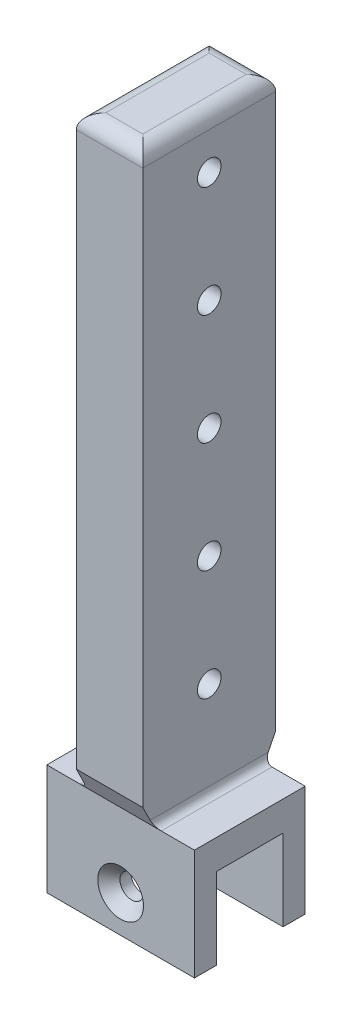
ISO-10303-21;
HEADER;
FILE_DESCRIPTION(('STEP AP214'),'2;1');
FILE_NAME('part.step','',(''),(''),'','','');
FILE_SCHEMA(('AUTOMOTIVE_DESIGN { 1 0 10303 214 1 1 1 1 }'));
ENDSEC;
DATA;
#1=APPLICATION_CONTEXT('core data for automotive mechanical design processes');
#2=APPLICATION_PROTOCOL_DEFINITION('international standard','automotive_design',2000,#1);
#3=PRODUCT_CONTEXT('',#1,'mechanical');
#4=PRODUCT('Part','Part','',(#3));
#5=PRODUCT_RELATED_PRODUCT_CATEGORY('part','',(#4));
#6=PRODUCT_DEFINITION_FORMATION('','',#4);
#7=PRODUCT_DEFINITION_CONTEXT('part definition',#1,'design');
#8=PRODUCT_DEFINITION('design','',#6,#7);
#9=PRODUCT_DEFINITION_SHAPE('','',#8);
#10=(LENGTH_UNIT() NAMED_UNIT(*) SI_UNIT(.MILLI.,.METRE.));
#11=(NAMED_UNIT(*) PLANE_ANGLE_UNIT() SI_UNIT($,.RADIAN.));
#12=(NAMED_UNIT(*) SI_UNIT($,.STERADIAN.) SOLID_ANGLE_UNIT());
#13=UNCERTAINTY_MEASURE_WITH_UNIT(LENGTH_MEASURE(1.E-05),#10,'distance_accuracy_value','');
#14=(GEOMETRIC_REPRESENTATION_CONTEXT(3) GLOBAL_UNCERTAINTY_ASSIGNED_CONTEXT((#13)) GLOBAL_UNIT_ASSIGNED_CONTEXT((#10,
#11,#12)) REPRESENTATION_CONTEXT('',''));
#15=CARTESIAN_POINT('',(0.,0.,0.));
#16=DIRECTION('',(0.,0.,1.));
#17=DIRECTION('',(1.,0.,0.));
#18=AXIS2_PLACEMENT_3D('',#15,#16,#17);
#19=CARTESIAN_POINT('',(0.,-15.,0.));
#20=DIRECTION('',(0.,-1.,0.));
#21=DIRECTION('',(0.,0.,-1.));
#22=AXIS2_PLACEMENT_3D('',#19,#20,#21);
#23=PLANE('',#22);
#24=DIRECTION('',(1.,0.,0.));
#25=VECTOR('',#24,1.);
#26=CARTESIAN_POINT('',(-14.5,-15.,-4.50000000000001));
#27=LINE('',#26,#25);
#28=CARTESIAN_POINT('',(-14.5,-15.,-4.50000000000001));
#29=VERTEX_POINT('',#28);
#30=CARTESIAN_POINT('',(5.5,-15.,-4.50000000000001));
#31=VERTEX_POINT('',#30);
#32=EDGE_CURVE('E392',#29,#31,#27,.T.);
#33=ORIENTED_EDGE('',*,*,#32,.T.);
#34=DIRECTION('',(0.,0.,1.));
#35=VECTOR('',#34,1.);
#36=CARTESIAN_POINT('',(5.5,-15.,-1.5));
#37=LINE('',#36,#35);
#38=CARTESIAN_POINT('',(5.5,-15.,-1.5));
#39=VERTEX_POINT('',#38);
#40=EDGE_CURVE('E381',#31,#39,#37,.T.);
#41=ORIENTED_EDGE('',*,*,#40,.T.);
#42=DIRECTION('',(-1.,0.,0.));
#43=VECTOR('',#42,1.);
#44=CARTESIAN_POINT('',(-14.5,-15.,-1.5));
#45=LINE('',#44,#43);
#46=CARTESIAN_POINT('',(-14.5,-15.,-1.5));
#47=VERTEX_POINT('',#46);
#48=EDGE_CURVE('E384',#39,#47,#45,.T.);
#49=ORIENTED_EDGE('',*,*,#48,.T.);
#50=DIRECTION('',(0.,0.,-1.));
#51=VECTOR('',#50,1.);
#52=CARTESIAN_POINT('',(-14.5,-15.,-1.5));
#53=LINE('',#52,#51);
#54=EDGE_CURVE('E367',#47,#29,#53,.T.);
#55=ORIENTED_EDGE('',*,*,#54,.T.);
#56=EDGE_LOOP('',(#33,#41,#49,#55));
#57=FACE_BOUND('',#56,.T.);
#58=ADVANCED_FACE('F43',(#57),#23,.T.);
#59=CARTESIAN_POINT('',(0.,80.,0.));
#60=DIRECTION('',(-1.,0.,0.));
#61=DIRECTION('',(0.,0.,1.));
#62=AXIS2_PLACEMENT_3D('',#59,#60,#61);
#63=PLANE('',#62);
#64=CARTESIAN_POINT('',(0.,73.,-9.));
#65=DIRECTION('',(1.,0.,0.));
#66=DIRECTION('',(0.,0.,-1.));
#67=AXIS2_PLACEMENT_3D('',#64,#65,#66);
#68=CIRCLE('',#67,1.6);
#69=CARTESIAN_POINT('',(0.,73.,-10.6));
#70=VERTEX_POINT('',#69);
#71=EDGE_CURVE('E260',#70,#70,#68,.T.);
#72=ORIENTED_EDGE('',*,*,#71,.F.);
#73=EDGE_LOOP('',(#72));
#74=FACE_BOUND('',#73,.T.);
#75=CARTESIAN_POINT('',(0.,58.,-9.00000000000001));
#76=DIRECTION('',(1.,0.,0.));
#77=DIRECTION('',(0.,0.,-1.));
#78=AXIS2_PLACEMENT_3D('',#75,#76,#77);
#79=CIRCLE('',#78,1.6);
#80=CARTESIAN_POINT('',(0.,58.,-10.6));
#81=VERTEX_POINT('',#80);
#82=EDGE_CURVE('E458',#81,#81,#79,.T.);
#83=ORIENTED_EDGE('',*,*,#82,.F.);
#84=EDGE_LOOP('',(#83));
#85=FACE_BOUND('',#84,.T.);
#86=CARTESIAN_POINT('',(0.,43.,-9.));
#87=DIRECTION('',(1.,0.,0.));
#88=DIRECTION('',(0.,0.,-1.));
#89=AXIS2_PLACEMENT_3D('',#86,#87,#88);
#90=CIRCLE('',#89,1.6);
#91=CARTESIAN_POINT('',(0.,43.,-10.6));
#92=VERTEX_POINT('',#91);
#93=EDGE_CURVE('E462',#92,#92,#90,.T.);
#94=ORIENTED_EDGE('',*,*,#93,.F.);
#95=EDGE_LOOP('',(#94));
#96=FACE_BOUND('',#95,.T.);
#97=CARTESIAN_POINT('',(0.,28.,-9.));
#98=DIRECTION('',(1.,0.,0.));
#99=DIRECTION('',(0.,0.,-1.));
#100=AXIS2_PLACEMENT_3D('',#97,#98,#99);
#101=CIRCLE('',#100,1.6);
#102=CARTESIAN_POINT('',(0.,28.,-10.6));
#103=VERTEX_POINT('',#102);
#104=EDGE_CURVE('E450',#103,#103,#101,.T.);
#105=ORIENTED_EDGE('',*,*,#104,.F.);
#106=EDGE_LOOP('',(#105));
#107=FACE_BOUND('',#106,.T.);
#108=CARTESIAN_POINT('',(0.,13.,-9.));
#109=DIRECTION('',(1.,0.,0.));
#110=DIRECTION('',(0.,0.,-1.));
#111=AXIS2_PLACEMENT_3D('',#108,#109,#110);
#112=CIRCLE('',#111,1.6);
#113=CARTESIAN_POINT('',(0.,13.,-10.6));
#114=VERTEX_POINT('',#113);
#115=EDGE_CURVE('E444',#114,#114,#112,.T.);
#116=ORIENTED_EDGE('',*,*,#115,.F.);
#117=EDGE_LOOP('',(#116));
#118=FACE_BOUND('',#117,.T.);
#119=DIRECTION('',(0.,-0.894427190999916,-0.447213595499958));
#120=VECTOR('',#119,1.);
#121=CARTESIAN_POINT('',(0.,64.6,30.8));
#122=LINE('',#121,#120);
#123=CARTESIAN_POINT('',(0.,3.,0.));
#124=VERTEX_POINT('',#123);
#125=CARTESIAN_POINT('',(0.,1.,-0.999999999999994));
#126=VERTEX_POINT('',#125);
#127=EDGE_CURVE('E189',#124,#126,#122,.T.);
#128=ORIENTED_EDGE('',*,*,#127,.T.);
#129=DIRECTION('',(0.,0.,-1.));
#130=VECTOR('',#129,1.);
#131=CARTESIAN_POINT('',(0.,1.,-16.5));
#132=LINE('',#131,#130);
#133=CARTESIAN_POINT('',(0.,0.999999999999987,-17.));
#134=VERTEX_POINT('',#133);
#135=EDGE_CURVE('E239',#126,#134,#132,.T.);
#136=ORIENTED_EDGE('',*,*,#135,.T.);
#137=DIRECTION('',(0.,0.894427190999916,-0.447213595499958));
#138=VECTOR('',#137,1.);
#139=CARTESIAN_POINT('',(0.,57.4,-45.2));
#140=LINE('',#139,#138);
#141=CARTESIAN_POINT('',(0.,3.,-18.));
#142=VERTEX_POINT('',#141);
#143=EDGE_CURVE('E442',#134,#142,#140,.T.);
#144=ORIENTED_EDGE('',*,*,#143,.T.);
#145=DIRECTION('',(0.,-1.,0.));
#146=VECTOR('',#145,1.);
#147=CARTESIAN_POINT('',(0.,80.,-18.));
#148=LINE('',#147,#146);
#149=CARTESIAN_POINT('',(0.,78.,-18.));
#150=VERTEX_POINT('',#149);
#151=EDGE_CURVE('E187',#150,#142,#148,.T.);
#152=ORIENTED_EDGE('',*,*,#151,.F.);
#153=DIRECTION('',(0.,0.,-1.));
#154=VECTOR('',#153,1.);
#155=CARTESIAN_POINT('',(0.,78.,0.));
#156=LINE('',#155,#154);
#157=CARTESIAN_POINT('',(0.,78.,0.));
#158=VERTEX_POINT('',#157);
#159=EDGE_CURVE('E231',#150,#158,#156,.F.);
#160=ORIENTED_EDGE('',*,*,#159,.T.);
#161=DIRECTION('',(0.,-1.,0.));
#162=VECTOR('',#161,1.);
#163=CARTESIAN_POINT('',(0.,80.,0.));
#164=LINE('',#163,#162);
#165=EDGE_CURVE('E204',#158,#124,#164,.T.);
#166=ORIENTED_EDGE('',*,*,#165,.T.);
#167=EDGE_LOOP('',(#128,#136,#144,#152,#160,#166));
#168=FACE_BOUND('',#167,.T.);
#169=ADVANCED_FACE('F318',(#74,#85,#96,#107,#118,#168),#63,.F.);
#170=CARTESIAN_POINT('',(0.,80.,-18.));
#171=DIRECTION('',(0.,0.,1.));
#172=DIRECTION('',(1.,0.,0.));
#173=AXIS2_PLACEMENT_3D('',#170,#171,#172);
#174=PLANE('',#173);
#175=ORIENTED_EDGE('',*,*,#151,.T.);
#176=DIRECTION('',(-1.,0.,0.));
#177=VECTOR('',#176,1.);
#178=CARTESIAN_POINT('',(1.,3.,-18.));
#179=LINE('',#178,#177);
#180=CARTESIAN_POINT('',(-9.,3.,-18.));
#181=VERTEX_POINT('',#180);
#182=EDGE_CURVE('E170',#142,#181,#179,.T.);
#183=ORIENTED_EDGE('',*,*,#182,.T.);
#184=DIRECTION('',(0.,-1.,0.));
#185=VECTOR('',#184,1.);
#186=CARTESIAN_POINT('',(-9.,80.,-18.));
#187=LINE('',#186,#185);
#188=CARTESIAN_POINT('',(-9.,78.,-18.));
#189=VERTEX_POINT('',#188);
#190=EDGE_CURVE('E184',#189,#181,#187,.T.);
#191=ORIENTED_EDGE('',*,*,#190,.F.);
#192=DIRECTION('',(-1.,0.,0.));
#193=VECTOR('',#192,1.);
#194=CARTESIAN_POINT('',(0.,78.,-18.));
#195=LINE('',#194,#193);
#196=EDGE_CURVE('E236',#189,#150,#195,.F.);
#197=ORIENTED_EDGE('',*,*,#196,.T.);
#198=EDGE_LOOP('',(#175,#183,#191,#197));
#199=FACE_BOUND('',#198,.T.);
#200=ADVANCED_FACE('F183',(#199),#174,.F.);
#201=CARTESIAN_POINT('',(-9.,80.,0.));
#202=DIRECTION('',(1.,0.,0.));
#203=DIRECTION('',(0.,0.,-1.));
#204=AXIS2_PLACEMENT_3D('',#201,#202,#203);
#205=PLANE('',#204);
#206=CARTESIAN_POINT('',(-9.,73.,-9.));
#207=DIRECTION('',(1.,0.,0.));
#208=DIRECTION('',(0.,0.,-1.));
#209=AXIS2_PLACEMENT_3D('',#206,#207,#208);
#210=CIRCLE('',#209,1.6);
#211=CARTESIAN_POINT('',(-9.,73.,-10.6));
#212=VERTEX_POINT('',#211);
#213=EDGE_CURVE('E244',#212,#212,#210,.T.);
#214=ORIENTED_EDGE('',*,*,#213,.T.);
#215=EDGE_LOOP('',(#214));
#216=FACE_BOUND('',#215,.T.);
#217=CARTESIAN_POINT('',(-9.,58.,-9.00000000000001));
#218=DIRECTION('',(1.,0.,0.));
#219=DIRECTION('',(0.,0.,-1.));
#220=AXIS2_PLACEMENT_3D('',#217,#218,#219);
#221=CIRCLE('',#220,1.6);
#222=CARTESIAN_POINT('',(-9.,58.,-10.6));
#223=VERTEX_POINT('',#222);
#224=EDGE_CURVE('E268',#223,#223,#221,.T.);
#225=ORIENTED_EDGE('',*,*,#224,.T.);
#226=EDGE_LOOP('',(#225));
#227=FACE_BOUND('',#226,.T.);
#228=CARTESIAN_POINT('',(-9.,43.,-9.));
#229=DIRECTION('',(1.,0.,0.));
#230=DIRECTION('',(0.,0.,-1.));
#231=AXIS2_PLACEMENT_3D('',#228,#229,#230);
#232=CIRCLE('',#231,1.6);
#233=CARTESIAN_POINT('',(-9.,43.,-10.6));
#234=VERTEX_POINT('',#233);
#235=EDGE_CURVE('E264',#234,#234,#232,.T.);
#236=ORIENTED_EDGE('',*,*,#235,.T.);
#237=EDGE_LOOP('',(#236));
#238=FACE_BOUND('',#237,.T.);
#239=CARTESIAN_POINT('',(-9.,28.,-9.));
#240=DIRECTION('',(1.,0.,0.));
#241=DIRECTION('',(0.,0.,-1.));
#242=AXIS2_PLACEMENT_3D('',#239,#240,#241);
#243=CIRCLE('',#242,1.6);
#244=CARTESIAN_POINT('',(-9.,28.,-10.6));
#245=VERTEX_POINT('',#244);
#246=EDGE_CURVE('E259',#245,#245,#243,.T.);
#247=ORIENTED_EDGE('',*,*,#246,.T.);
#248=EDGE_LOOP('',(#247));
#249=FACE_BOUND('',#248,.T.);
#250=CARTESIAN_POINT('',(-9.,13.,-9.));
#251=DIRECTION('',(1.,0.,0.));
#252=DIRECTION('',(0.,0.,-1.));
#253=AXIS2_PLACEMENT_3D('',#250,#251,#252);
#254=CIRCLE('',#253,1.6);
#255=CARTESIAN_POINT('',(-9.,13.,-10.6));
#256=VERTEX_POINT('',#255);
#257=EDGE_CURVE('E255',#256,#256,#254,.T.);
#258=ORIENTED_EDGE('',*,*,#257,.T.);
#259=EDGE_LOOP('',(#258));
#260=FACE_BOUND('',#259,.T.);
#261=DIRECTION('',(0.,0.894427190999916,-0.447213595499957));
#262=VECTOR('',#261,1.);
#263=CARTESIAN_POINT('',(-9.,0.,-16.5));
#264=LINE('',#263,#262);
#265=CARTESIAN_POINT('',(-9.,1.,-17.));
#266=VERTEX_POINT('',#265);
#267=EDGE_CURVE('E165',#266,#181,#264,.T.);
#268=ORIENTED_EDGE('',*,*,#267,.F.);
#269=DIRECTION('',(0.,0.,1.));
#270=VECTOR('',#269,1.);
#271=CARTESIAN_POINT('',(-9.,1.,-1.5));
#272=LINE('',#271,#270);
#273=CARTESIAN_POINT('',(-9.,1.,-0.999999999999997));
#274=VERTEX_POINT('',#273);
#275=EDGE_CURVE('E282',#266,#274,#272,.T.);
#276=ORIENTED_EDGE('',*,*,#275,.T.);
#277=DIRECTION('',(0.,-0.894427190999916,-0.447213595499958));
#278=VECTOR('',#277,1.);
#279=CARTESIAN_POINT('',(-9.,0.,-1.5));
#280=LINE('',#279,#278);
#281=CARTESIAN_POINT('',(-9.,3.,0.));
#282=VERTEX_POINT('',#281);
#283=EDGE_CURVE('E560',#282,#274,#280,.T.);
#284=ORIENTED_EDGE('',*,*,#283,.F.);
#285=DIRECTION('',(0.,-1.,0.));
#286=VECTOR('',#285,1.);
#287=CARTESIAN_POINT('',(-9.,80.,0.));
#288=LINE('',#287,#286);
#289=CARTESIAN_POINT('',(-9.,78.,0.));
#290=VERTEX_POINT('',#289);
#291=EDGE_CURVE('E196',#290,#282,#288,.T.);
#292=ORIENTED_EDGE('',*,*,#291,.F.);
#293=DIRECTION('',(0.,0.,1.));
#294=VECTOR('',#293,1.);
#295=CARTESIAN_POINT('',(-9.,78.,-18.));
#296=LINE('',#295,#294);
#297=EDGE_CURVE('E194',#290,#189,#296,.F.);
#298=ORIENTED_EDGE('',*,*,#297,.T.);
#299=ORIENTED_EDGE('',*,*,#190,.T.);
#300=EDGE_LOOP('',(#268,#276,#284,#292,#298,#299));
#301=FACE_BOUND('',#300,.T.);
#302=ADVANCED_FACE('F191',(#216,#227,#238,#249,#260,#301),#205,.F.);
#303=CARTESIAN_POINT('',(0.,80.,0.));
#304=DIRECTION('',(0.,0.,-1.));
#305=DIRECTION('',(-1.,0.,0.));
#306=AXIS2_PLACEMENT_3D('',#303,#304,#305);
#307=PLANE('',#306);
#308=ORIENTED_EDGE('',*,*,#291,.T.);
#309=DIRECTION('',(-1.,0.,0.));
#310=VECTOR('',#309,1.);
#311=CARTESIAN_POINT('',(1.,3.,0.));
#312=LINE('',#311,#310);
#313=EDGE_CURVE('E179',#124,#282,#312,.T.);
#314=ORIENTED_EDGE('',*,*,#313,.F.);
#315=ORIENTED_EDGE('',*,*,#165,.F.);
#316=DIRECTION('',(1.,0.,0.));
#317=VECTOR('',#316,1.);
#318=CARTESIAN_POINT('',(-9.,78.,0.));
#319=LINE('',#318,#317);
#320=EDGE_CURVE('E227',#158,#290,#319,.F.);
#321=ORIENTED_EDGE('',*,*,#320,.T.);
#322=EDGE_LOOP('',(#308,#314,#315,#321));
#323=FACE_BOUND('',#322,.T.);
#324=ADVANCED_FACE('F423',(#323),#307,.F.);
#325=CARTESIAN_POINT('',(0.,80.,0.));
#326=DIRECTION('',(0.,1.,0.));
#327=DIRECTION('',(0.,0.,1.));
#328=AXIS2_PLACEMENT_3D('',#325,#326,#327);
#329=PLANE('',#328);
#330=DIRECTION('',(0.,0.,1.));
#331=VECTOR('',#330,1.);
#332=CARTESIAN_POINT('',(-7.,80.,0.));
#333=LINE('',#332,#331);
#334=CARTESIAN_POINT('',(-7.,80.,-16.));
#335=VERTEX_POINT('',#334);
#336=CARTESIAN_POINT('',(-7.,80.,-2.));
#337=VERTEX_POINT('',#336);
#338=EDGE_CURVE('E217',#335,#337,#333,.T.);
#339=ORIENTED_EDGE('',*,*,#338,.T.);
#340=DIRECTION('',(1.,0.,0.));
#341=VECTOR('',#340,1.);
#342=CARTESIAN_POINT('',(0.,80.,-2.));
#343=LINE('',#342,#341);
#344=CARTESIAN_POINT('',(-2.,80.,-2.));
#345=VERTEX_POINT('',#344);
#346=EDGE_CURVE('E223',#337,#345,#343,.T.);
#347=ORIENTED_EDGE('',*,*,#346,.T.);
#348=DIRECTION('',(0.,0.,-1.));
#349=VECTOR('',#348,1.);
#350=CARTESIAN_POINT('',(-2.,80.,-18.));
#351=LINE('',#350,#349);
#352=CARTESIAN_POINT('',(-2.,80.,-16.));
#353=VERTEX_POINT('',#352);
#354=EDGE_CURVE('E220',#345,#353,#351,.T.);
#355=ORIENTED_EDGE('',*,*,#354,.T.);
#356=DIRECTION('',(-1.,0.,0.));
#357=VECTOR('',#356,1.);
#358=CARTESIAN_POINT('',(-9.,80.,-16.));
#359=LINE('',#358,#357);
#360=EDGE_CURVE('E214',#353,#335,#359,.T.);
#361=ORIENTED_EDGE('',*,*,#360,.T.);
#362=EDGE_LOOP('',(#339,#347,#355,#361));
#363=FACE_BOUND('',#362,.T.);
#364=ADVANCED_FACE('F435',(#363),#329,.T.);
#365=CARTESIAN_POINT('',(0.,0.,0.));
#366=DIRECTION('',(0.,-1.,0.));
#367=DIRECTION('',(0.,0.,-1.));
#368=AXIS2_PLACEMENT_3D('',#365,#366,#367);
#369=PLANE('',#368);
#370=DIRECTION('',(1.,0.,0.));
#371=VECTOR('',#370,1.);
#372=CARTESIAN_POINT('',(-14.5,0.,-16.5));
#373=LINE('',#372,#371);
#374=CARTESIAN_POINT('',(0.999999999999999,0.,-16.5));
#375=VERTEX_POINT('',#374);
#376=CARTESIAN_POINT('',(5.5,0.,-16.5));
#377=VERTEX_POINT('',#376);
#378=EDGE_CURVE('E391',#375,#377,#373,.T.);
#379=ORIENTED_EDGE('',*,*,#378,.F.);
#380=DIRECTION('',(0.,0.,-1.));
#381=VECTOR('',#380,1.);
#382=CARTESIAN_POINT('',(1.,0.,-1.5));
#383=LINE('',#382,#381);
#384=CARTESIAN_POINT('',(1.,0.,-1.5));
#385=VERTEX_POINT('',#384);
#386=EDGE_CURVE('E278',#375,#385,#383,.F.);
#387=ORIENTED_EDGE('',*,*,#386,.T.);
#388=DIRECTION('',(-1.,0.,0.));
#389=VECTOR('',#388,1.);
#390=CARTESIAN_POINT('',(-14.5,0.,-1.5));
#391=LINE('',#390,#389);
#392=CARTESIAN_POINT('',(5.5,0.,-1.5));
#393=VERTEX_POINT('',#392);
#394=EDGE_CURVE('E368',#393,#385,#391,.T.);
#395=ORIENTED_EDGE('',*,*,#394,.F.);
#396=DIRECTION('',(0.,0.,1.));
#397=VECTOR('',#396,1.);
#398=CARTESIAN_POINT('',(5.5,0.,-1.5));
#399=LINE('',#398,#397);
#400=EDGE_CURVE('E397',#377,#393,#399,.T.);
#401=ORIENTED_EDGE('',*,*,#400,.F.);
#402=EDGE_LOOP('',(#379,#387,#395,#401));
#403=FACE_BOUND('',#402,.T.);
#404=ADVANCED_FACE('F339',(#403),#369,.F.);
#405=CARTESIAN_POINT('',(-14.5,-15.,-1.5));
#406=DIRECTION('',(1.,0.,0.));
#407=DIRECTION('',(0.,0.,-1.));
#408=AXIS2_PLACEMENT_3D('',#405,#406,#407);
#409=PLANE('',#408);
#410=DIRECTION('',(0.,0.,1.));
#411=VECTOR('',#410,1.);
#412=CARTESIAN_POINT('',(-14.5,-4.,-13.5));
#413=LINE('',#412,#411);
#414=CARTESIAN_POINT('',(-14.5,-4.,-13.5));
#415=VERTEX_POINT('',#414);
#416=CARTESIAN_POINT('',(-14.5,-4.,-4.50000000000001));
#417=VERTEX_POINT('',#416);
#418=EDGE_CURVE('E478',#415,#417,#413,.T.);
#419=ORIENTED_EDGE('',*,*,#418,.T.);
#420=DIRECTION('',(0.,-1.,0.));
#421=VECTOR('',#420,1.);
#422=CARTESIAN_POINT('',(-14.5,-4.,-4.50000000000001));
#423=LINE('',#422,#421);
#424=EDGE_CURVE('E355',#417,#29,#423,.T.);
#425=ORIENTED_EDGE('',*,*,#424,.T.);
#426=ORIENTED_EDGE('',*,*,#54,.F.);
#427=DIRECTION('',(0.,1.,0.));
#428=VECTOR('',#427,1.);
#429=CARTESIAN_POINT('',(-14.5,-15.,-1.5));
#430=LINE('',#429,#428);
#431=CARTESIAN_POINT('',(-14.5,0.,-1.5));
#432=VERTEX_POINT('',#431);
#433=EDGE_CURVE('E387',#47,#432,#430,.T.);
#434=ORIENTED_EDGE('',*,*,#433,.T.);
#435=DIRECTION('',(0.,0.,-1.));
#436=VECTOR('',#435,1.);
#437=CARTESIAN_POINT('',(-14.5,0.,-1.5));
#438=LINE('',#437,#436);
#439=CARTESIAN_POINT('',(-14.5,0.,-16.5));
#440=VERTEX_POINT('',#439);
#441=EDGE_CURVE('E388',#432,#440,#438,.T.);
#442=ORIENTED_EDGE('',*,*,#441,.T.);
#443=DIRECTION('',(0.,1.,0.));
#444=VECTOR('',#443,1.);
#445=CARTESIAN_POINT('',(-14.5,-15.,-16.5));
#446=LINE('',#445,#444);
#447=CARTESIAN_POINT('',(-14.5,-15.,-16.5));
#448=VERTEX_POINT('',#447);
#449=EDGE_CURVE('E365',#448,#440,#446,.T.);
#450=ORIENTED_EDGE('',*,*,#449,.F.);
#451=CARTESIAN_POINT('',(-14.5,-15.,-13.5));
#452=VERTEX_POINT('',#451);
#453=EDGE_CURVE('E346',#452,#448,#53,.T.);
#454=ORIENTED_EDGE('',*,*,#453,.F.);
#455=DIRECTION('',(0.,1.,0.));
#456=VECTOR('',#455,1.);
#457=CARTESIAN_POINT('',(-14.5,-15.,-13.5));
#458=LINE('',#457,#456);
#459=EDGE_CURVE('E362',#452,#415,#458,.T.);
#460=ORIENTED_EDGE('',*,*,#459,.T.);
#461=EDGE_LOOP('',(#419,#425,#426,#434,#442,#450,#454,#460));
#462=FACE_BOUND('',#461,.T.);
#463=ADVANCED_FACE('F361',(#462),#409,.F.);
#464=CARTESIAN_POINT('',(-14.5,-15.,-16.5));
#465=DIRECTION('',(0.,0.,1.));
#466=DIRECTION('',(1.,0.,0.));
#467=AXIS2_PLACEMENT_3D('',#464,#465,#466);
#468=PLANE('',#467);
#469=CARTESIAN_POINT('',(-4.5,-10.,-16.5));
#470=DIRECTION('',(0.,0.,-1.));
#471=DIRECTION('',(-1.,0.,0.));
#472=AXIS2_PLACEMENT_3D('',#469,#470,#471);
#473=CIRCLE('',#472,1.6);
#474=CARTESIAN_POINT('',(-6.1,-10.,-16.5));
#475=VERTEX_POINT('',#474);
#476=EDGE_CURVE('E213',#475,#475,#473,.T.);
#477=ORIENTED_EDGE('',*,*,#476,.F.);
#478=EDGE_LOOP('',(#477));
#479=FACE_BOUND('',#478,.T.);
#480=CARTESIAN_POINT('',(-10.,0.,-16.5));
#481=VERTEX_POINT('',#480);
#482=EDGE_CURVE('E393',#440,#481,#373,.T.);
#483=ORIENTED_EDGE('',*,*,#482,.T.);
#484=EDGE_CURVE('E201',#481,#375,#373,.T.);
#485=ORIENTED_EDGE('',*,*,#484,.T.);
#486=ORIENTED_EDGE('',*,*,#378,.T.);
#487=DIRECTION('',(0.,1.,0.));
#488=VECTOR('',#487,1.);
#489=CARTESIAN_POINT('',(5.5,-15.,-16.5));
#490=LINE('',#489,#488);
#491=CARTESIAN_POINT('',(5.5,-15.,-16.5));
#492=VERTEX_POINT('',#491);
#493=EDGE_CURVE('E407',#492,#377,#490,.T.);
#494=ORIENTED_EDGE('',*,*,#493,.F.);
#495=DIRECTION('',(1.,0.,0.));
#496=VECTOR('',#495,1.);
#497=CARTESIAN_POINT('',(-14.5,-15.,-16.5));
#498=LINE('',#497,#496);
#499=EDGE_CURVE('E374',#448,#492,#498,.T.);
#500=ORIENTED_EDGE('',*,*,#499,.F.);
#501=ORIENTED_EDGE('',*,*,#449,.T.);
#502=EDGE_LOOP('',(#483,#485,#486,#494,#500,#501));
#503=FACE_BOUND('',#502,.T.);
#504=ADVANCED_FACE('F516',(#479,#503),#468,.F.);
#505=CARTESIAN_POINT('',(5.5,-15.,-1.5));
#506=DIRECTION('',(-1.,0.,0.));
#507=DIRECTION('',(0.,0.,1.));
#508=AXIS2_PLACEMENT_3D('',#505,#506,#507);
#509=PLANE('',#508);
#510=ORIENTED_EDGE('',*,*,#40,.F.);
#511=DIRECTION('',(0.,-1.,0.));
#512=VECTOR('',#511,1.);
#513=CARTESIAN_POINT('',(5.5,-4.,-4.5));
#514=LINE('',#513,#512);
#515=CARTESIAN_POINT('',(5.5,-4.,-4.5));
#516=VERTEX_POINT('',#515);
#517=EDGE_CURVE('E479',#516,#31,#514,.T.);
#518=ORIENTED_EDGE('',*,*,#517,.F.);
#519=DIRECTION('',(0.,0.,1.));
#520=VECTOR('',#519,1.);
#521=CARTESIAN_POINT('',(5.5,-4.,-13.5));
#522=LINE('',#521,#520);
#523=CARTESIAN_POINT('',(5.5,-4.,-13.5));
#524=VERTEX_POINT('',#523);
#525=EDGE_CURVE('E487',#524,#516,#522,.T.);
#526=ORIENTED_EDGE('',*,*,#525,.F.);
#527=DIRECTION('',(0.,1.,0.));
#528=VECTOR('',#527,1.);
#529=CARTESIAN_POINT('',(5.5,-15.,-13.5));
#530=LINE('',#529,#528);
#531=CARTESIAN_POINT('',(5.5,-15.,-13.5));
#532=VERTEX_POINT('',#531);
#533=EDGE_CURVE('E475',#532,#524,#530,.T.);
#534=ORIENTED_EDGE('',*,*,#533,.F.);
#535=EDGE_CURVE('E349',#492,#532,#37,.T.);
#536=ORIENTED_EDGE('',*,*,#535,.F.);
#537=ORIENTED_EDGE('',*,*,#493,.T.);
#538=ORIENTED_EDGE('',*,*,#400,.T.);
#539=DIRECTION('',(0.,1.,0.));
#540=VECTOR('',#539,1.);
#541=CARTESIAN_POINT('',(5.5,-15.,-1.5));
#542=LINE('',#541,#540);
#543=EDGE_CURVE('E403',#39,#393,#542,.T.);
#544=ORIENTED_EDGE('',*,*,#543,.F.);
#545=EDGE_LOOP('',(#510,#518,#526,#534,#536,#537,#538,#544));
#546=FACE_BOUND('',#545,.T.);
#547=ADVANCED_FACE('F340',(#546),#509,.F.);
#548=CARTESIAN_POINT('',(-14.5,-15.,-1.5));
#549=DIRECTION('',(0.,0.,-1.));
#550=DIRECTION('',(-1.,0.,0.));
#551=AXIS2_PLACEMENT_3D('',#548,#549,#550);
#552=PLANE('',#551);
#553=CARTESIAN_POINT('',(-4.5,-10.,-1.5));
#554=DIRECTION('',(0.,0.,-1.));
#555=DIRECTION('',(-1.,0.,0.));
#556=AXIS2_PLACEMENT_3D('',#553,#554,#555);
#557=CIRCLE('',#556,3.09999999999999);
#558=CARTESIAN_POINT('',(-7.59999999999999,-10.,-1.5));
#559=VERTEX_POINT('',#558);
#560=EDGE_CURVE('E54',#559,#559,#557,.T.);
#561=ORIENTED_EDGE('',*,*,#560,.T.);
#562=EDGE_LOOP('',(#561));
#563=FACE_BOUND('',#562,.T.);
#564=ORIENTED_EDGE('',*,*,#394,.T.);
#565=CARTESIAN_POINT('',(-10.,0.,-1.5));
#566=VERTEX_POINT('',#565);
#567=EDGE_CURVE('E61',#385,#566,#391,.T.);
#568=ORIENTED_EDGE('',*,*,#567,.T.);
#569=EDGE_CURVE('E375',#566,#432,#391,.T.);
#570=ORIENTED_EDGE('',*,*,#569,.T.);
#571=ORIENTED_EDGE('',*,*,#433,.F.);
#572=ORIENTED_EDGE('',*,*,#48,.F.);
#573=ORIENTED_EDGE('',*,*,#543,.T.);
#574=EDGE_LOOP('',(#564,#568,#570,#571,#572,#573));
#575=FACE_BOUND('',#574,.T.);
#576=ADVANCED_FACE('F306',(#563,#575),#552,.F.);
#577=DIRECTION('',(1.,0.,0.));
#578=VECTOR('',#577,1.);
#579=CARTESIAN_POINT('',(-14.5,-15.,-13.5));
#580=LINE('',#579,#578);
#581=EDGE_CURVE('E344',#452,#532,#580,.T.);
#582=ORIENTED_EDGE('',*,*,#581,.F.);
#583=ORIENTED_EDGE('',*,*,#453,.T.);
#584=ORIENTED_EDGE('',*,*,#499,.T.);
#585=ORIENTED_EDGE('',*,*,#535,.T.);
#586=EDGE_LOOP('',(#582,#583,#584,#585));
#587=FACE_BOUND('',#586,.T.);
#588=ADVANCED_FACE('F321',(#587),#23,.T.);
#589=ORIENTED_EDGE('',*,*,#569,.F.);
#590=DIRECTION('',(0.,0.,1.));
#591=VECTOR('',#590,1.);
#592=CARTESIAN_POINT('',(-10.,0.,-16.5));
#593=LINE('',#592,#591);
#594=EDGE_CURVE('E285',#566,#481,#593,.F.);
#595=ORIENTED_EDGE('',*,*,#594,.T.);
#596=ORIENTED_EDGE('',*,*,#482,.F.);
#597=ORIENTED_EDGE('',*,*,#441,.F.);
#598=EDGE_LOOP('',(#589,#595,#596,#597));
#599=FACE_BOUND('',#598,.T.);
#600=ADVANCED_FACE('F331',(#599),#369,.F.);
#601=CARTESIAN_POINT('',(-14.5,-4.,-4.50000000000001));
#602=DIRECTION('',(0.,0.,1.));
#603=DIRECTION('',(0.,-1.,0.));
#604=AXIS2_PLACEMENT_3D('',#601,#602,#603);
#605=PLANE('',#604);
#606=CARTESIAN_POINT('',(-4.5,-10.,-4.50000000000001));
#607=DIRECTION('',(0.,0.,1.));
#608=DIRECTION('',(0.,-1.,0.));
#609=AXIS2_PLACEMENT_3D('',#606,#607,#608);
#610=CIRCLE('',#609,1.6);
#611=CARTESIAN_POINT('',(-4.5,-11.6,-4.50000000000001));
#612=VERTEX_POINT('',#611);
#613=EDGE_CURVE('E212',#612,#612,#610,.T.);
#614=ORIENTED_EDGE('',*,*,#613,.T.);
#615=EDGE_LOOP('',(#614));
#616=FACE_BOUND('',#615,.T.);
#617=ORIENTED_EDGE('',*,*,#517,.T.);
#618=ORIENTED_EDGE('',*,*,#32,.F.);
#619=ORIENTED_EDGE('',*,*,#424,.F.);
#620=DIRECTION('',(1.,0.,0.));
#621=VECTOR('',#620,1.);
#622=CARTESIAN_POINT('',(-14.5,-4.,-4.50000000000001));
#623=LINE('',#622,#621);
#624=EDGE_CURVE('E495',#417,#516,#623,.T.);
#625=ORIENTED_EDGE('',*,*,#624,.T.);
#626=EDGE_LOOP('',(#617,#618,#619,#625));
#627=FACE_BOUND('',#626,.T.);
#628=ADVANCED_FACE('F337',(#616,#627),#605,.F.);
#629=CARTESIAN_POINT('',(-14.5,-4.,-13.5));
#630=DIRECTION('',(0.,1.,0.));
#631=DIRECTION('',(0.,0.,1.));
#632=AXIS2_PLACEMENT_3D('',#629,#630,#631);
#633=PLANE('',#632);
#634=ORIENTED_EDGE('',*,*,#525,.T.);
#635=ORIENTED_EDGE('',*,*,#624,.F.);
#636=ORIENTED_EDGE('',*,*,#418,.F.);
#637=DIRECTION('',(1.,0.,0.));
#638=VECTOR('',#637,1.);
#639=CARTESIAN_POINT('',(-14.5,-4.,-13.5));
#640=LINE('',#639,#638);
#641=EDGE_CURVE('E354',#415,#524,#640,.T.);
#642=ORIENTED_EDGE('',*,*,#641,.T.);
#643=EDGE_LOOP('',(#634,#635,#636,#642));
#644=FACE_BOUND('',#643,.T.);
#645=ADVANCED_FACE('F501',(#644),#633,.F.);
#646=CARTESIAN_POINT('',(-14.5,-15.,-13.5));
#647=DIRECTION('',(0.,0.,-1.));
#648=DIRECTION('',(-1.,0.,0.));
#649=AXIS2_PLACEMENT_3D('',#646,#647,#648);
#650=PLANE('',#649);
#651=CARTESIAN_POINT('',(-4.5,-10.,-13.5));
#652=DIRECTION('',(0.,0.,-1.));
#653=DIRECTION('',(-1.,0.,0.));
#654=AXIS2_PLACEMENT_3D('',#651,#652,#653);
#655=CIRCLE('',#654,1.6);
#656=CARTESIAN_POINT('',(-6.1,-10.,-13.5));
#657=VERTEX_POINT('',#656);
#658=EDGE_CURVE('E208',#657,#657,#655,.T.);
#659=ORIENTED_EDGE('',*,*,#658,.T.);
#660=EDGE_LOOP('',(#659));
#661=FACE_BOUND('',#660,.T.);
#662=ORIENTED_EDGE('',*,*,#533,.T.);
#663=ORIENTED_EDGE('',*,*,#641,.F.);
#664=ORIENTED_EDGE('',*,*,#459,.F.);
#665=ORIENTED_EDGE('',*,*,#581,.T.);
#666=EDGE_LOOP('',(#662,#663,#664,#665));
#667=FACE_BOUND('',#666,.T.);
#668=ADVANCED_FACE('F504',(#661,#667),#650,.F.);
#669=CARTESIAN_POINT('',(-4.5,-10.,3.5));
#670=DIRECTION('',(0.,0.,-1.));
#671=DIRECTION('',(-1.,0.,0.));
#672=AXIS2_PLACEMENT_3D('',#669,#670,#671);
#673=CYLINDRICAL_SURFACE('',#672,1.6);
#674=ORIENTED_EDGE('',*,*,#476,.T.);
#675=EDGE_LOOP('',(#674));
#676=FACE_BOUND('',#675,.T.);
#677=ORIENTED_EDGE('',*,*,#658,.F.);
#678=EDGE_LOOP('',(#677));
#679=FACE_BOUND('',#678,.T.);
#680=ADVANCED_FACE('F599',(#676,#679),#673,.F.);
#681=CARTESIAN_POINT('',(-4.5,-10.,-3.));
#682=DIRECTION('',(0.,0.,-1.));
#683=DIRECTION('',(-1.,0.,0.));
#684=AXIS2_PLACEMENT_3D('',#681,#682,#683);
#685=CIRCLE('',#684,1.6);
#686=CARTESIAN_POINT('',(-6.1,-10.,-3.));
#687=VERTEX_POINT('',#686);
#688=EDGE_CURVE('E12',#687,#687,#685,.F.);
#689=ORIENTED_EDGE('',*,*,#688,.T.);
#690=EDGE_LOOP('',(#689));
#691=FACE_BOUND('',#690,.T.);
#692=ORIENTED_EDGE('',*,*,#613,.F.);
#693=EDGE_LOOP('',(#692));
#694=FACE_BOUND('',#693,.T.);
#695=ADVANCED_FACE('F596',(#691,#694),#673,.F.);
#696=CARTESIAN_POINT('',(0.,78.,-16.));
#697=DIRECTION('',(1.,0.,0.));
#698=DIRECTION('',(0.,0.,-1.));
#699=AXIS2_PLACEMENT_3D('',#696,#697,#698);
#700=CYLINDRICAL_SURFACE('',#699,2.);
#701=CARTESIAN_POINT('',(-2.,78.,-16.));
#702=DIRECTION('',(0.707106781186548,0.,0.707106781186547));
#703=DIRECTION('',(0.707106781186547,0.,-0.707106781186548));
#704=AXIS2_PLACEMENT_3D('',#701,#702,#703);
#705=ELLIPSE('',#704,2.82842712474619,2.);
#706=EDGE_CURVE('E247',#150,#353,#705,.T.);
#707=ORIENTED_EDGE('',*,*,#706,.F.);
#708=ORIENTED_EDGE('',*,*,#196,.F.);
#709=CARTESIAN_POINT('',(-7.,78.,-16.));
#710=DIRECTION('',(0.707106781186547,0.,-0.707106781186548));
#711=DIRECTION('',(0.707106781186548,0.,0.707106781186547));
#712=AXIS2_PLACEMENT_3D('',#709,#710,#711);
#713=ELLIPSE('',#712,2.82842712474619,2.);
#714=EDGE_CURVE('E251',#335,#189,#713,.F.);
#715=ORIENTED_EDGE('',*,*,#714,.F.);
#716=ORIENTED_EDGE('',*,*,#360,.F.);
#717=EDGE_LOOP('',(#707,#708,#715,#716));
#718=FACE_BOUND('',#717,.T.);
#719=ADVANCED_FACE('F441',(#718),#700,.T.);
#720=CARTESIAN_POINT('',(-7.,78.,0.));
#721=DIRECTION('',(0.,0.,-1.));
#722=DIRECTION('',(-1.,0.,0.));
#723=AXIS2_PLACEMENT_3D('',#720,#721,#722);
#724=CYLINDRICAL_SURFACE('',#723,2.);
#725=ORIENTED_EDGE('',*,*,#714,.T.);
#726=ORIENTED_EDGE('',*,*,#297,.F.);
#727=CARTESIAN_POINT('',(-7.,78.,-2.));
#728=DIRECTION('',(-0.707106781186547,0.,-0.707106781186547));
#729=DIRECTION('',(0.707106781186547,0.,-0.707106781186548));
#730=AXIS2_PLACEMENT_3D('',#727,#728,#729);
#731=ELLIPSE('',#730,2.82842712474619,2.);
#732=EDGE_CURVE('E243',#337,#290,#731,.F.);
#733=ORIENTED_EDGE('',*,*,#732,.F.);
#734=ORIENTED_EDGE('',*,*,#338,.F.);
#735=EDGE_LOOP('',(#725,#726,#733,#734));
#736=FACE_BOUND('',#735,.T.);
#737=ADVANCED_FACE('F439',(#736),#724,.T.);
#738=CARTESIAN_POINT('',(-2.,78.,0.));
#739=DIRECTION('',(0.,0.,1.));
#740=DIRECTION('',(1.,0.,0.));
#741=AXIS2_PLACEMENT_3D('',#738,#739,#740);
#742=CYLINDRICAL_SURFACE('',#741,2.);
#743=ORIENTED_EDGE('',*,*,#706,.T.);
#744=ORIENTED_EDGE('',*,*,#354,.F.);
#745=CARTESIAN_POINT('',(-2.,78.,-2.));
#746=DIRECTION('',(-0.707106781186547,0.,0.707106781186548));
#747=DIRECTION('',(0.707106781186548,0.,0.707106781186547));
#748=AXIS2_PLACEMENT_3D('',#745,#746,#747);
#749=ELLIPSE('',#748,2.82842712474619,2.);
#750=EDGE_CURVE('E240',#158,#345,#749,.T.);
#751=ORIENTED_EDGE('',*,*,#750,.F.);
#752=ORIENTED_EDGE('',*,*,#159,.F.);
#753=EDGE_LOOP('',(#743,#744,#751,#752));
#754=FACE_BOUND('',#753,.T.);
#755=ADVANCED_FACE('F431',(#754),#742,.T.);
#756=CARTESIAN_POINT('',(0.,78.,-2.));
#757=DIRECTION('',(-1.,0.,0.));
#758=DIRECTION('',(0.,0.,1.));
#759=AXIS2_PLACEMENT_3D('',#756,#757,#758);
#760=CYLINDRICAL_SURFACE('',#759,2.);
#761=ORIENTED_EDGE('',*,*,#732,.T.);
#762=ORIENTED_EDGE('',*,*,#320,.F.);
#763=ORIENTED_EDGE('',*,*,#750,.T.);
#764=ORIENTED_EDGE('',*,*,#346,.F.);
#765=EDGE_LOOP('',(#761,#762,#763,#764));
#766=FACE_BOUND('',#765,.T.);
#767=ADVANCED_FACE('F426',(#766),#760,.T.);
#768=CARTESIAN_POINT('',(-10.,13.,-9.));
#769=DIRECTION('',(1.,0.,0.));
#770=DIRECTION('',(0.,0.,-1.));
#771=AXIS2_PLACEMENT_3D('',#768,#769,#770);
#772=CYLINDRICAL_SURFACE('',#771,1.6);
#773=ORIENTED_EDGE('',*,*,#115,.T.);
#774=EDGE_LOOP('',(#773));
#775=FACE_BOUND('',#774,.T.);
#776=ORIENTED_EDGE('',*,*,#257,.F.);
#777=EDGE_LOOP('',(#776));
#778=FACE_BOUND('',#777,.T.);
#779=ADVANCED_FACE('F591',(#775,#778),#772,.F.);
#780=CARTESIAN_POINT('',(-10.,28.,-9.));
#781=DIRECTION('',(1.,0.,0.));
#782=DIRECTION('',(0.,0.,-1.));
#783=AXIS2_PLACEMENT_3D('',#780,#781,#782);
#784=CYLINDRICAL_SURFACE('',#783,1.6);
#785=ORIENTED_EDGE('',*,*,#104,.T.);
#786=EDGE_LOOP('',(#785));
#787=FACE_BOUND('',#786,.T.);
#788=ORIENTED_EDGE('',*,*,#246,.F.);
#789=EDGE_LOOP('',(#788));
#790=FACE_BOUND('',#789,.T.);
#791=ADVANCED_FACE('F587',(#787,#790),#784,.F.);
#792=CARTESIAN_POINT('',(-10.,43.,-9.));
#793=DIRECTION('',(1.,0.,0.));
#794=DIRECTION('',(0.,0.,-1.));
#795=AXIS2_PLACEMENT_3D('',#792,#793,#794);
#796=CYLINDRICAL_SURFACE('',#795,1.6);
#797=ORIENTED_EDGE('',*,*,#93,.T.);
#798=EDGE_LOOP('',(#797));
#799=FACE_BOUND('',#798,.T.);
#800=ORIENTED_EDGE('',*,*,#235,.F.);
#801=EDGE_LOOP('',(#800));
#802=FACE_BOUND('',#801,.T.);
#803=ADVANCED_FACE('F583',(#799,#802),#796,.F.);
#804=CARTESIAN_POINT('',(-10.,58.,-9.00000000000001));
#805=DIRECTION('',(1.,0.,0.));
#806=DIRECTION('',(0.,0.,-1.));
#807=AXIS2_PLACEMENT_3D('',#804,#805,#806);
#808=CYLINDRICAL_SURFACE('',#807,1.6);
#809=ORIENTED_EDGE('',*,*,#82,.T.);
#810=EDGE_LOOP('',(#809));
#811=FACE_BOUND('',#810,.T.);
#812=ORIENTED_EDGE('',*,*,#224,.F.);
#813=EDGE_LOOP('',(#812));
#814=FACE_BOUND('',#813,.T.);
#815=ADVANCED_FACE('F577',(#811,#814),#808,.F.);
#816=CARTESIAN_POINT('',(-10.,73.,-9.));
#817=DIRECTION('',(1.,0.,0.));
#818=DIRECTION('',(0.,0.,-1.));
#819=AXIS2_PLACEMENT_3D('',#816,#817,#818);
#820=CYLINDRICAL_SURFACE('',#819,1.6);
#821=ORIENTED_EDGE('',*,*,#71,.T.);
#822=EDGE_LOOP('',(#821));
#823=FACE_BOUND('',#822,.T.);
#824=ORIENTED_EDGE('',*,*,#213,.F.);
#825=EDGE_LOOP('',(#824));
#826=FACE_BOUND('',#825,.T.);
#827=ADVANCED_FACE('F570',(#823,#826),#820,.F.);
#828=CARTESIAN_POINT('',(1.,0.,-1.5));
#829=DIRECTION('',(0.,0.447213595499958,-0.894427190999916));
#830=DIRECTION('',(0.,0.894427190999916,0.447213595499958));
#831=AXIS2_PLACEMENT_3D('',#828,#829,#830);
#832=PLANE('',#831);
#833=ORIENTED_EDGE('',*,*,#313,.T.);
#834=ORIENTED_EDGE('',*,*,#283,.T.);
#835=CARTESIAN_POINT('',(-10.,1.,-0.999999999999998));
#836=DIRECTION('',(0.,0.447213595499958,-0.894427190999916));
#837=DIRECTION('',(0.,-0.894427190999916,-0.447213595499958));
#838=AXIS2_PLACEMENT_3D('',#835,#836,#837);
#839=ELLIPSE('',#838,1.11803398874989,1.);
#840=EDGE_CURVE('E296',#274,#566,#839,.T.);
#841=ORIENTED_EDGE('',*,*,#840,.T.);
#842=ORIENTED_EDGE('',*,*,#567,.F.);
#843=CARTESIAN_POINT('',(1.,1.,-0.999999999999996));
#844=DIRECTION('',(0.,0.447213595499958,-0.894427190999916));
#845=DIRECTION('',(0.,0.894427190999916,0.447213595499958));
#846=AXIS2_PLACEMENT_3D('',#843,#844,#845);
#847=ELLIPSE('',#846,1.11803398874989,1.);
#848=EDGE_CURVE('E293',#385,#126,#847,.T.);
#849=ORIENTED_EDGE('',*,*,#848,.T.);
#850=ORIENTED_EDGE('',*,*,#127,.F.);
#851=EDGE_LOOP('',(#833,#834,#841,#842,#849,#850));
#852=FACE_BOUND('',#851,.T.);
#853=ADVANCED_FACE('F526',(#852),#832,.F.);
#854=CARTESIAN_POINT('',(1.,0.,-16.5));
#855=DIRECTION('',(0.,0.447213595499957,0.894427190999916));
#856=DIRECTION('',(0.,-0.894427190999916,0.447213595499958));
#857=AXIS2_PLACEMENT_3D('',#854,#855,#856);
#858=PLANE('',#857);
#859=ORIENTED_EDGE('',*,*,#484,.F.);
#860=CARTESIAN_POINT('',(-10.,1.,-17.));
#861=DIRECTION('',(0.,0.447213595499957,0.894427190999916));
#862=DIRECTION('',(0.,0.894427190999916,-0.447213595499958));
#863=AXIS2_PLACEMENT_3D('',#860,#861,#862);
#864=ELLIPSE('',#863,1.11803398874989,1.);
#865=EDGE_CURVE('E173',#481,#266,#864,.T.);
#866=ORIENTED_EDGE('',*,*,#865,.T.);
#867=ORIENTED_EDGE('',*,*,#267,.T.);
#868=ORIENTED_EDGE('',*,*,#182,.F.);
#869=ORIENTED_EDGE('',*,*,#143,.F.);
#870=CARTESIAN_POINT('',(1.,1.,-17.));
#871=DIRECTION('',(0.,0.447213595499957,0.894427190999916));
#872=DIRECTION('',(0.,-0.894427190999916,0.447213595499958));
#873=AXIS2_PLACEMENT_3D('',#870,#871,#872);
#874=ELLIPSE('',#873,1.11803398874989,1.);
#875=EDGE_CURVE('E289',#134,#375,#874,.T.);
#876=ORIENTED_EDGE('',*,*,#875,.T.);
#877=EDGE_LOOP('',(#859,#866,#867,#868,#869,#876));
#878=FACE_BOUND('',#877,.T.);
#879=ADVANCED_FACE('F168',(#878),#858,.F.);
#880=CARTESIAN_POINT('',(1.,1.,0.));
#881=DIRECTION('',(0.,0.,1.));
#882=DIRECTION('',(1.,0.,0.));
#883=AXIS2_PLACEMENT_3D('',#880,#881,#882);
#884=CYLINDRICAL_SURFACE('',#883,1.);
#885=ORIENTED_EDGE('',*,*,#848,.F.);
#886=ORIENTED_EDGE('',*,*,#386,.F.);
#887=ORIENTED_EDGE('',*,*,#875,.F.);
#888=ORIENTED_EDGE('',*,*,#135,.F.);
#889=EDGE_LOOP('',(#885,#886,#887,#888));
#890=FACE_BOUND('',#889,.T.);
#891=ADVANCED_FACE('F314',(#890),#884,.F.);
#892=CARTESIAN_POINT('',(-10.,1.,0.));
#893=DIRECTION('',(0.,0.,-1.));
#894=DIRECTION('',(-1.,0.,0.));
#895=AXIS2_PLACEMENT_3D('',#892,#893,#894);
#896=CYLINDRICAL_SURFACE('',#895,1.);
#897=ORIENTED_EDGE('',*,*,#865,.F.);
#898=ORIENTED_EDGE('',*,*,#594,.F.);
#899=ORIENTED_EDGE('',*,*,#840,.F.);
#900=ORIENTED_EDGE('',*,*,#275,.F.);
#901=EDGE_LOOP('',(#897,#898,#899,#900));
#902=FACE_BOUND('',#901,.T.);
#903=ADVANCED_FACE('F309',(#902),#896,.F.);
#904=CARTESIAN_POINT('',(-4.5,-10.,-1.5));
#905=DIRECTION('',(0.,0.,1.));
#906=DIRECTION('',(1.,0.,0.));
#907=AXIS2_PLACEMENT_3D('',#904,#905,#906);
#908=CONICAL_SURFACE('',#907,3.09999999999999,0.785398163397446);
#909=ORIENTED_EDGE('',*,*,#688,.F.);
#910=EDGE_LOOP('',(#909));
#911=FACE_BOUND('',#910,.T.);
#912=ORIENTED_EDGE('',*,*,#560,.F.);
#913=EDGE_LOOP('',(#912));
#914=FACE_BOUND('',#913,.T.);
#915=ADVANCED_FACE('F46',(#911,#914),#908,.F.);
#916=CLOSED_SHELL('',(#58,#169,#200,#302,#324,#364,#404,#463,#504,#547,#576,#588,#600,#628,#645,
#668,#680,#695,#719,#737,#755,#767,#779,#791,#803,#815,#827,#853,#879,#891,#903,#915));
#917=MANIFOLD_SOLID_BREP('B2',#916);
#918=ADVANCED_BREP_SHAPE_REPRESENTATION('',(#18,#917),#14);
#919=SHAPE_DEFINITION_REPRESENTATION(#9,#918);
ENDSEC;
END-ISO-10303-21;
